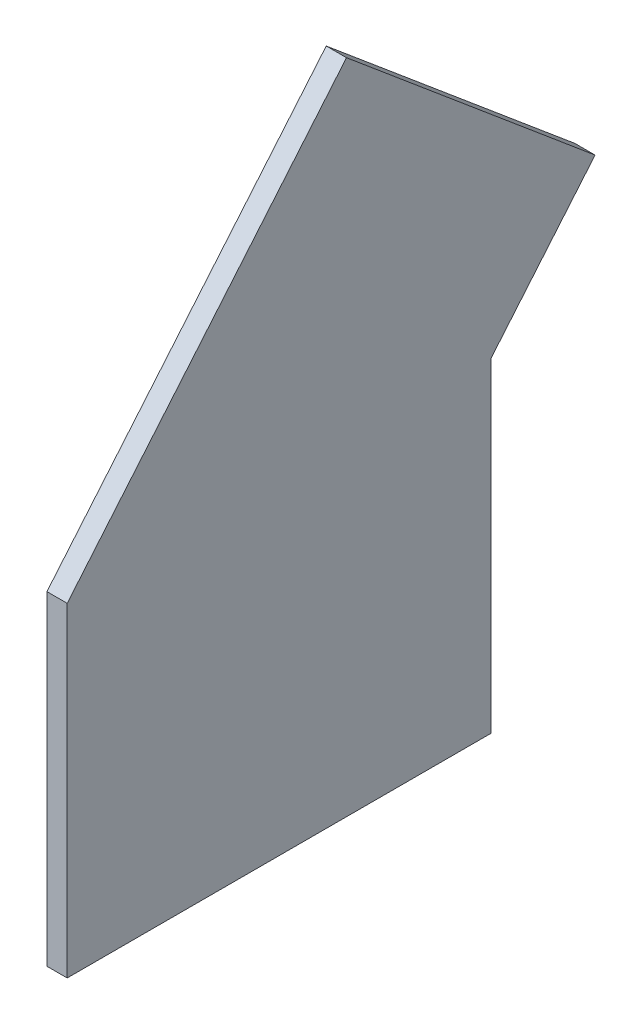
ISO-10303-21;
HEADER;
FILE_DESCRIPTION(('STEP AP214'),'2;1');
FILE_NAME('part.step','',(''),(''),'','','');
FILE_SCHEMA(('AUTOMOTIVE_DESIGN { 1 0 10303 214 1 1 1 1 }'));
ENDSEC;
DATA;
#1=APPLICATION_CONTEXT('core data for automotive mechanical design processes');
#2=APPLICATION_PROTOCOL_DEFINITION('international standard','automotive_design',2000,#1);
#3=PRODUCT_CONTEXT('',#1,'mechanical');
#4=PRODUCT('Part','Part','',(#3));
#5=PRODUCT_RELATED_PRODUCT_CATEGORY('part','',(#4));
#6=PRODUCT_DEFINITION_FORMATION('','',#4);
#7=PRODUCT_DEFINITION_CONTEXT('part definition',#1,'design');
#8=PRODUCT_DEFINITION('design','',#6,#7);
#9=PRODUCT_DEFINITION_SHAPE('','',#8);
#10=(LENGTH_UNIT() NAMED_UNIT(*) SI_UNIT(.MILLI.,.METRE.));
#11=(NAMED_UNIT(*) PLANE_ANGLE_UNIT() SI_UNIT($,.RADIAN.));
#12=(NAMED_UNIT(*) SI_UNIT($,.STERADIAN.) SOLID_ANGLE_UNIT());
#13=UNCERTAINTY_MEASURE_WITH_UNIT(LENGTH_MEASURE(1.E-05),#10,'distance_accuracy_value','');
#14=(GEOMETRIC_REPRESENTATION_CONTEXT(3) GLOBAL_UNCERTAINTY_ASSIGNED_CONTEXT((#13)) GLOBAL_UNIT_ASSIGNED_CONTEXT((#10,
#11,#12)) REPRESENTATION_CONTEXT('',''));
#15=CARTESIAN_POINT('',(0.,0.,0.));
#16=DIRECTION('',(0.,0.,1.));
#17=DIRECTION('',(1.,0.,0.));
#18=AXIS2_PLACEMENT_3D('',#15,#16,#17);
#19=CARTESIAN_POINT('',(3.175,0.,66.3146902980798));
#20=DIRECTION('',(0.,1.,0.));
#21=DIRECTION('',(0.,0.,1.));
#22=AXIS2_PLACEMENT_3D('',#19,#20,#21);
#23=PLANE('',#22);
#24=DIRECTION('',(0.,0.,-1.));
#25=VECTOR('',#24,1.);
#26=CARTESIAN_POINT('',(0.,0.,66.3146902980798));
#27=LINE('',#26,#25);
#28=CARTESIAN_POINT('',(0.,0.,66.3146902980798));
#29=VERTEX_POINT('',#28);
#30=CARTESIAN_POINT('',(0.,0.,0.));
#31=VERTEX_POINT('',#30);
#32=EDGE_CURVE('E137',#29,#31,#27,.T.);
#33=ORIENTED_EDGE('',*,*,#32,.T.);
#34=DIRECTION('',(-1.,0.,0.));
#35=VECTOR('',#34,1.);
#36=CARTESIAN_POINT('',(3.175,0.,0.));
#37=LINE('',#36,#35);
#38=CARTESIAN_POINT('',(3.175,0.,0.));
#39=VERTEX_POINT('',#38);
#40=EDGE_CURVE('E11',#39,#31,#37,.T.);
#41=ORIENTED_EDGE('',*,*,#40,.F.);
#42=DIRECTION('',(0.,0.,-1.));
#43=VECTOR('',#42,1.);
#44=CARTESIAN_POINT('',(3.175,0.,66.3146902980798));
#45=LINE('',#44,#43);
#46=CARTESIAN_POINT('',(3.175,0.,66.3146902980798));
#47=VERTEX_POINT('',#46);
#48=EDGE_CURVE('E150',#47,#39,#45,.T.);
#49=ORIENTED_EDGE('',*,*,#48,.F.);
#50=DIRECTION('',(-1.,0.,0.));
#51=VECTOR('',#50,1.);
#52=CARTESIAN_POINT('',(3.175,0.,66.3146902980798));
#53=LINE('',#52,#51);
#54=EDGE_CURVE('E133',#47,#29,#53,.T.);
#55=ORIENTED_EDGE('',*,*,#54,.T.);
#56=EDGE_LOOP('',(#33,#41,#49,#55));
#57=FACE_BOUND('',#56,.T.);
#58=ADVANCED_FACE('F43',(#57),#23,.F.);
#59=CARTESIAN_POINT('',(3.175,0.,0.));
#60=DIRECTION('',(0.,0.,1.));
#61=DIRECTION('',(1.,0.,0.));
#62=AXIS2_PLACEMENT_3D('',#59,#60,#61);
#63=PLANE('',#62);
#64=DIRECTION('',(0.,1.,0.));
#65=VECTOR('',#64,1.);
#66=CARTESIAN_POINT('',(0.,0.,0.));
#67=LINE('',#66,#65);
#68=CARTESIAN_POINT('',(0.,50.8,0.));
#69=VERTEX_POINT('',#68);
#70=EDGE_CURVE('E141',#31,#69,#67,.T.);
#71=ORIENTED_EDGE('',*,*,#70,.T.);
#72=DIRECTION('',(-1.,0.,0.));
#73=VECTOR('',#72,1.);
#74=CARTESIAN_POINT('',(3.175,50.8,0.));
#75=LINE('',#74,#73);
#76=CARTESIAN_POINT('',(3.175,50.8,0.));
#77=VERTEX_POINT('',#76);
#78=EDGE_CURVE('E52',#77,#69,#75,.T.);
#79=ORIENTED_EDGE('',*,*,#78,.F.);
#80=DIRECTION('',(0.,1.,0.));
#81=VECTOR('',#80,1.);
#82=CARTESIAN_POINT('',(3.175,0.,0.));
#83=LINE('',#82,#81);
#84=EDGE_CURVE('E103',#39,#77,#83,.T.);
#85=ORIENTED_EDGE('',*,*,#84,.F.);
#86=ORIENTED_EDGE('',*,*,#40,.T.);
#87=EDGE_LOOP('',(#71,#79,#85,#86));
#88=FACE_BOUND('',#87,.T.);
#89=ADVANCED_FACE('F176',(#88),#63,.F.);
#90=CARTESIAN_POINT('',(3.175,50.8,0.));
#91=DIRECTION('',(0.,0.64278760968654,0.766044443118978));
#92=DIRECTION('',(0.,-0.766044443118978,0.64278760968654));
#93=AXIS2_PLACEMENT_3D('',#90,#91,#92);
#94=PLANE('',#93);
#95=DIRECTION('',(0.,0.766044443118978,-0.64278760968654));
#96=VECTOR('',#95,1.);
#97=CARTESIAN_POINT('',(0.,50.8,0.));
#98=LINE('',#97,#96);
#99=CARTESIAN_POINT('',(0.,70.257528855222,-16.3268052860381));
#100=VERTEX_POINT('',#99);
#101=EDGE_CURVE('E143',#69,#100,#98,.T.);
#102=ORIENTED_EDGE('',*,*,#101,.T.);
#103=DIRECTION('',(-1.,0.,0.));
#104=VECTOR('',#103,1.);
#105=CARTESIAN_POINT('',(3.175,70.257528855222,-16.3268052860381));
#106=LINE('',#105,#104);
#107=CARTESIAN_POINT('',(3.175,70.257528855222,-16.3268052860381));
#108=VERTEX_POINT('',#107);
#109=EDGE_CURVE('E125',#108,#100,#106,.T.);
#110=ORIENTED_EDGE('',*,*,#109,.F.);
#111=DIRECTION('',(0.,0.766044443118978,-0.64278760968654));
#112=VECTOR('',#111,1.);
#113=CARTESIAN_POINT('',(3.175,50.8,0.));
#114=LINE('',#113,#112);
#115=EDGE_CURVE('E116',#77,#108,#114,.T.);
#116=ORIENTED_EDGE('',*,*,#115,.F.);
#117=ORIENTED_EDGE('',*,*,#78,.T.);
#118=EDGE_LOOP('',(#102,#110,#116,#117));
#119=FACE_BOUND('',#118,.T.);
#120=ADVANCED_FACE('F158',(#119),#94,.F.);
#121=CARTESIAN_POINT('',(3.175,102.911139427298,22.5882524244059));
#122=DIRECTION('',(0.,-0.766044443118978,0.64278760968654));
#123=DIRECTION('',(0.,-0.64278760968654,-0.766044443118978));
#124=AXIS2_PLACEMENT_3D('',#121,#122,#123);
#125=PLANE('',#124);
#126=DIRECTION('',(0.,0.64278760968654,0.766044443118978));
#127=VECTOR('',#126,1.);
#128=CARTESIAN_POINT('',(0.,102.911139427298,22.5882524244059));
#129=LINE('',#128,#127);
#130=CARTESIAN_POINT('',(0.,102.911139427298,22.5882524244059));
#131=VERTEX_POINT('',#130);
#132=EDGE_CURVE('E124',#100,#131,#129,.T.);
#133=ORIENTED_EDGE('',*,*,#132,.T.);
#134=DIRECTION('',(-1.,0.,0.));
#135=VECTOR('',#134,1.);
#136=CARTESIAN_POINT('',(3.175,102.911139427298,22.5882524244059));
#137=LINE('',#136,#135);
#138=CARTESIAN_POINT('',(3.175,102.911139427298,22.5882524244059));
#139=VERTEX_POINT('',#138);
#140=EDGE_CURVE('E121',#139,#131,#137,.T.);
#141=ORIENTED_EDGE('',*,*,#140,.F.);
#142=DIRECTION('',(0.,0.64278760968654,0.766044443118978));
#143=VECTOR('',#142,1.);
#144=CARTESIAN_POINT('',(3.175,102.911139427298,22.5882524244059));
#145=LINE('',#144,#143);
#146=EDGE_CURVE('E110',#108,#139,#145,.T.);
#147=ORIENTED_EDGE('',*,*,#146,.F.);
#148=ORIENTED_EDGE('',*,*,#109,.T.);
#149=EDGE_LOOP('',(#133,#141,#147,#148));
#150=FACE_BOUND('',#149,.T.);
#151=ADVANCED_FACE('F122',(#150),#125,.F.);
#152=CARTESIAN_POINT('',(3.175,102.911139427298,22.5882524244059));
#153=DIRECTION('',(0.,-0.64278760968654,-0.766044443118977));
#154=DIRECTION('',(0.,0.766044443118977,-0.64278760968654));
#155=AXIS2_PLACEMENT_3D('',#152,#153,#154);
#156=PLANE('',#155);
#157=DIRECTION('',(0.,-0.766044443118977,0.64278760968654));
#158=VECTOR('',#157,1.);
#159=CARTESIAN_POINT('',(0.,102.911139427298,22.5882524244059));
#160=LINE('',#159,#158);
#161=CARTESIAN_POINT('',(0.,50.8,66.3146902980798));
#162=VERTEX_POINT('',#161);
#163=EDGE_CURVE('E88',#131,#162,#160,.T.);
#164=ORIENTED_EDGE('',*,*,#163,.T.);
#165=DIRECTION('',(-1.,0.,0.));
#166=VECTOR('',#165,1.);
#167=CARTESIAN_POINT('',(3.175,50.8,66.3146902980798));
#168=LINE('',#167,#166);
#169=CARTESIAN_POINT('',(3.175,50.8,66.3146902980798));
#170=VERTEX_POINT('',#169);
#171=EDGE_CURVE('E126',#170,#162,#168,.T.);
#172=ORIENTED_EDGE('',*,*,#171,.F.);
#173=DIRECTION('',(0.,-0.766044443118977,0.64278760968654));
#174=VECTOR('',#173,1.);
#175=CARTESIAN_POINT('',(3.175,102.911139427298,22.5882524244059));
#176=LINE('',#175,#174);
#177=EDGE_CURVE('E114',#139,#170,#176,.T.);
#178=ORIENTED_EDGE('',*,*,#177,.F.);
#179=ORIENTED_EDGE('',*,*,#140,.T.);
#180=EDGE_LOOP('',(#164,#172,#178,#179));
#181=FACE_BOUND('',#180,.T.);
#182=ADVANCED_FACE('F128',(#181),#156,.F.);
#183=CARTESIAN_POINT('',(3.175,50.8,66.3146902980798));
#184=DIRECTION('',(0.,0.,-1.));
#185=DIRECTION('',(-1.,0.,0.));
#186=AXIS2_PLACEMENT_3D('',#183,#184,#185);
#187=PLANE('',#186);
#188=DIRECTION('',(0.,-1.,0.));
#189=VECTOR('',#188,1.);
#190=CARTESIAN_POINT('',(0.,50.8,66.3146902980798));
#191=LINE('',#190,#189);
#192=EDGE_CURVE('E94',#162,#29,#191,.T.);
#193=ORIENTED_EDGE('',*,*,#192,.T.);
#194=ORIENTED_EDGE('',*,*,#54,.F.);
#195=DIRECTION('',(0.,-1.,0.));
#196=VECTOR('',#195,1.);
#197=CARTESIAN_POINT('',(3.175,50.8,66.3146902980798));
#198=LINE('',#197,#196);
#199=EDGE_CURVE('E63',#170,#47,#198,.T.);
#200=ORIENTED_EDGE('',*,*,#199,.F.);
#201=ORIENTED_EDGE('',*,*,#171,.T.);
#202=EDGE_LOOP('',(#193,#194,#200,#201));
#203=FACE_BOUND('',#202,.T.);
#204=ADVANCED_FACE('F165',(#203),#187,.F.);
#205=CARTESIAN_POINT('',(3.175,0.,0.));
#206=DIRECTION('',(1.,0.,0.));
#207=DIRECTION('',(0.,0.,-1.));
#208=AXIS2_PLACEMENT_3D('',#205,#206,#207);
#209=PLANE('',#208);
#210=ORIENTED_EDGE('',*,*,#48,.T.);
#211=ORIENTED_EDGE('',*,*,#84,.T.);
#212=ORIENTED_EDGE('',*,*,#115,.T.);
#213=ORIENTED_EDGE('',*,*,#146,.T.);
#214=ORIENTED_EDGE('',*,*,#177,.T.);
#215=ORIENTED_EDGE('',*,*,#199,.T.);
#216=EDGE_LOOP('',(#210,#211,#212,#213,#214,#215));
#217=FACE_BOUND('',#216,.T.);
#218=ADVANCED_FACE('F112',(#217),#209,.T.);
#219=CARTESIAN_POINT('',(0.,0.,0.));
#220=DIRECTION('',(1.,0.,0.));
#221=DIRECTION('',(0.,0.,-1.));
#222=AXIS2_PLACEMENT_3D('',#219,#220,#221);
#223=PLANE('',#222);
#224=ORIENTED_EDGE('',*,*,#32,.F.);
#225=ORIENTED_EDGE('',*,*,#192,.F.);
#226=ORIENTED_EDGE('',*,*,#163,.F.);
#227=ORIENTED_EDGE('',*,*,#132,.F.);
#228=ORIENTED_EDGE('',*,*,#101,.F.);
#229=ORIENTED_EDGE('',*,*,#70,.F.);
#230=EDGE_LOOP('',(#224,#225,#226,#227,#228,#229));
#231=FACE_BOUND('',#230,.T.);
#232=ADVANCED_FACE('F161',(#231),#223,.F.);
#233=CLOSED_SHELL('',(#58,#89,#120,#151,#182,#204,#218,#232));
#234=MANIFOLD_SOLID_BREP('B2',#233);
#235=ADVANCED_BREP_SHAPE_REPRESENTATION('',(#18,#234),#14);
#236=SHAPE_DEFINITION_REPRESENTATION(#9,#235);
ENDSEC;
END-ISO-10303-21;
